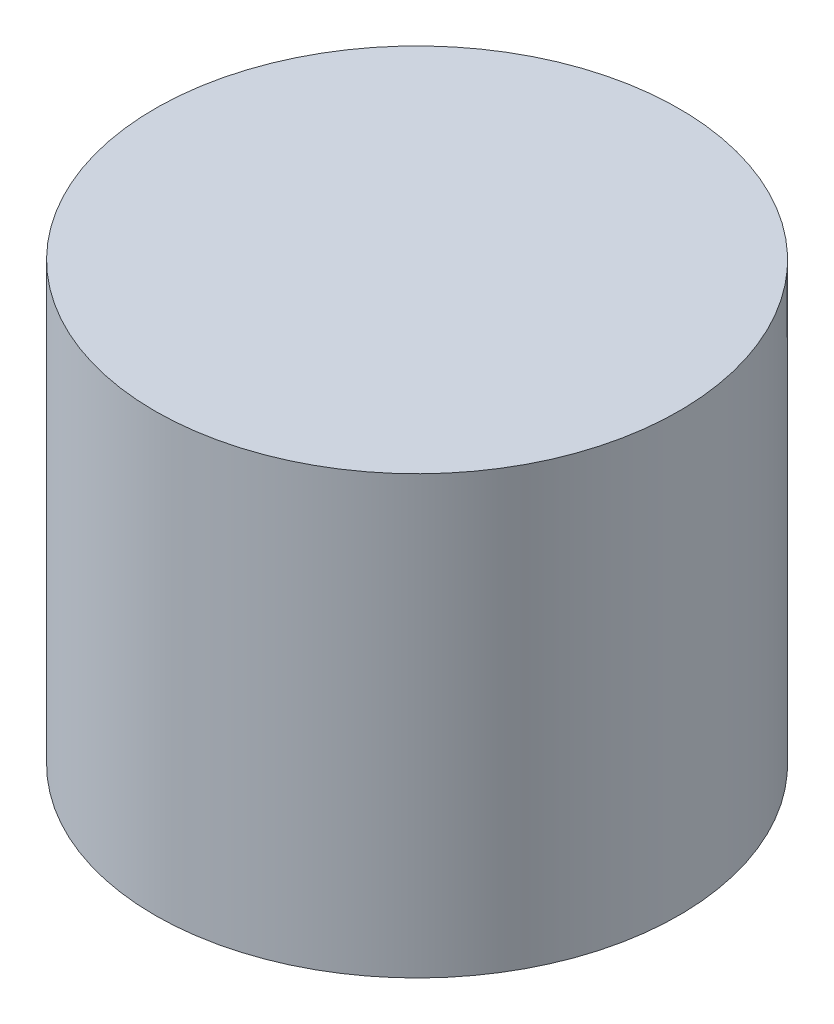
ISO-10303-21;
HEADER;
FILE_DESCRIPTION(('STEP AP214'),'2;1');
FILE_NAME('part.step','',(''),(''),'','','');
FILE_SCHEMA(('AUTOMOTIVE_DESIGN { 1 0 10303 214 1 1 1 1 }'));
ENDSEC;
DATA;
#1=APPLICATION_CONTEXT('core data for automotive mechanical design processes');
#2=APPLICATION_PROTOCOL_DEFINITION('international standard','automotive_design',2000,#1);
#3=PRODUCT_CONTEXT('',#1,'mechanical');
#4=PRODUCT('Part','Part','',(#3));
#5=PRODUCT_RELATED_PRODUCT_CATEGORY('part','',(#4));
#6=PRODUCT_DEFINITION_FORMATION('','',#4);
#7=PRODUCT_DEFINITION_CONTEXT('part definition',#1,'design');
#8=PRODUCT_DEFINITION('design','',#6,#7);
#9=PRODUCT_DEFINITION_SHAPE('','',#8);
#10=(LENGTH_UNIT() NAMED_UNIT(*) SI_UNIT(.MILLI.,.METRE.));
#11=(NAMED_UNIT(*) PLANE_ANGLE_UNIT() SI_UNIT($,.RADIAN.));
#12=(NAMED_UNIT(*) SI_UNIT($,.STERADIAN.) SOLID_ANGLE_UNIT());
#13=UNCERTAINTY_MEASURE_WITH_UNIT(LENGTH_MEASURE(1.E-05),#10,'distance_accuracy_value','');
#14=(GEOMETRIC_REPRESENTATION_CONTEXT(3) GLOBAL_UNCERTAINTY_ASSIGNED_CONTEXT((#13)) GLOBAL_UNIT_ASSIGNED_CONTEXT((#10,
#11,#12)) REPRESENTATION_CONTEXT('',''));
#15=CARTESIAN_POINT('',(0.,0.,0.));
#16=DIRECTION('',(0.,0.,1.));
#17=DIRECTION('',(1.,0.,0.));
#18=AXIS2_PLACEMENT_3D('',#15,#16,#17);
#19=CARTESIAN_POINT('',(-9.08013779901698,2.5,-8.35372677509554));
#20=DIRECTION('',(0.,-1.,0.));
#21=DIRECTION('',(0.,0.,-1.));
#22=AXIS2_PLACEMENT_3D('',#19,#20,#21);
#23=CYLINDRICAL_SURFACE('',#22,1.5);
#24=CARTESIAN_POINT('',(-9.08013779901698,2.5,-8.35372677509554));
#25=DIRECTION('',(0.,1.,0.));
#26=DIRECTION('',(0.,0.,1.));
#27=AXIS2_PLACEMENT_3D('',#24,#25,#26);
#28=CIRCLE('',#27,1.5);
#29=CARTESIAN_POINT('',(-9.08013779901698,2.5,-6.85372677509554));
#30=VERTEX_POINT('',#29);
#31=EDGE_CURVE('E10',#30,#30,#28,.T.);
#32=ORIENTED_EDGE('',*,*,#31,.F.);
#33=EDGE_LOOP('',(#32));
#34=FACE_BOUND('',#33,.T.);
#35=CARTESIAN_POINT('',(-9.08013779901698,0.,-8.35372677509554));
#36=DIRECTION('',(0.,1.,0.));
#37=DIRECTION('',(0.,0.,1.));
#38=AXIS2_PLACEMENT_3D('',#35,#36,#37);
#39=CIRCLE('',#38,1.5);
#40=CARTESIAN_POINT('',(-9.08013779901698,0.,-6.85372677509554));
#41=VERTEX_POINT('',#40);
#42=EDGE_CURVE('E40',#41,#41,#39,.T.);
#43=ORIENTED_EDGE('',*,*,#42,.T.);
#44=EDGE_LOOP('',(#43));
#45=FACE_BOUND('',#44,.T.);
#46=ADVANCED_FACE('F37',(#34,#45),#23,.T.);
#47=CARTESIAN_POINT('',(-9.08013779901698,2.5,-8.35372677509554));
#48=DIRECTION('',(0.,1.,0.));
#49=DIRECTION('',(0.,0.,1.));
#50=AXIS2_PLACEMENT_3D('',#47,#48,#49);
#51=PLANE('',#50);
#52=ORIENTED_EDGE('',*,*,#31,.T.);
#53=EDGE_LOOP('',(#52));
#54=FACE_BOUND('',#53,.T.);
#55=ADVANCED_FACE('F54',(#54),#51,.T.);
#56=CARTESIAN_POINT('',(-9.08013779901698,0.,-8.35372677509554));
#57=DIRECTION('',(0.,1.,0.));
#58=DIRECTION('',(0.,0.,1.));
#59=AXIS2_PLACEMENT_3D('',#56,#57,#58);
#60=PLANE('',#59);
#61=ORIENTED_EDGE('',*,*,#42,.F.);
#62=EDGE_LOOP('',(#61));
#63=FACE_BOUND('',#62,.T.);
#64=ADVANCED_FACE('F52',(#63),#60,.F.);
#65=CLOSED_SHELL('',(#46,#55,#64));
#66=MANIFOLD_SOLID_BREP('B2',#65);
#67=ADVANCED_BREP_SHAPE_REPRESENTATION('',(#18,#66),#14);
#68=SHAPE_DEFINITION_REPRESENTATION(#9,#67);
ENDSEC;
END-ISO-10303-21;
